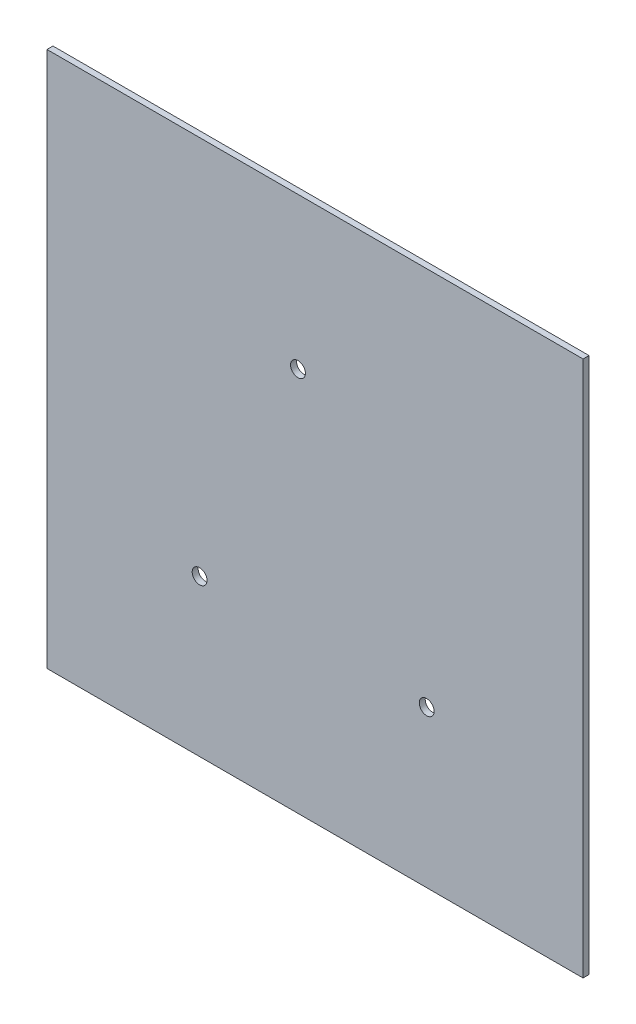
ISO-10303-21;
HEADER;
FILE_DESCRIPTION(('STEP AP214'),'2;1');
FILE_NAME('part.step','',(''),(''),'','','');
FILE_SCHEMA(('AUTOMOTIVE_DESIGN { 1 0 10303 214 1 1 1 1 }'));
ENDSEC;
DATA;
#1=APPLICATION_CONTEXT('core data for automotive mechanical design processes');
#2=APPLICATION_PROTOCOL_DEFINITION('international standard','automotive_design',2000,#1);
#3=PRODUCT_CONTEXT('',#1,'mechanical');
#4=PRODUCT('Part','Part','',(#3));
#5=PRODUCT_RELATED_PRODUCT_CATEGORY('part','',(#4));
#6=PRODUCT_DEFINITION_FORMATION('','',#4);
#7=PRODUCT_DEFINITION_CONTEXT('part definition',#1,'design');
#8=PRODUCT_DEFINITION('design','',#6,#7);
#9=PRODUCT_DEFINITION_SHAPE('','',#8);
#10=(LENGTH_UNIT() NAMED_UNIT(*) SI_UNIT(.MILLI.,.METRE.));
#11=(NAMED_UNIT(*) PLANE_ANGLE_UNIT() SI_UNIT($,.RADIAN.));
#12=(NAMED_UNIT(*) SI_UNIT($,.STERADIAN.) SOLID_ANGLE_UNIT());
#13=UNCERTAINTY_MEASURE_WITH_UNIT(LENGTH_MEASURE(1.E-05),#10,'distance_accuracy_value','');
#14=(GEOMETRIC_REPRESENTATION_CONTEXT(3) GLOBAL_UNCERTAINTY_ASSIGNED_CONTEXT((#13)) GLOBAL_UNIT_ASSIGNED_CONTEXT((#10,
#11,#12)) REPRESENTATION_CONTEXT('',''));
#15=CARTESIAN_POINT('',(0.,0.,0.));
#16=DIRECTION('',(0.,0.,1.));
#17=DIRECTION('',(1.,0.,0.));
#18=AXIS2_PLACEMENT_3D('',#15,#16,#17);
#19=CARTESIAN_POINT('',(0.,0.,2.54));
#20=DIRECTION('',(0.,0.,-1.));
#21=DIRECTION('',(-1.,0.,0.));
#22=AXIS2_PLACEMENT_3D('',#19,#20,#21);
#23=PLANE('',#22);
#24=CARTESIAN_POINT('',(-96.839734868248,-0.0738226508443449,2.54));
#25=DIRECTION('',(0.,0.,1.));
#26=DIRECTION('',(1.,0.,0.));
#27=AXIS2_PLACEMENT_3D('',#24,#25,#26);
#28=CIRCLE('',#27,3.175);
#29=CARTESIAN_POINT('',(-93.664734868248,-0.0738226508443449,2.54));
#30=VERTEX_POINT('',#29);
#31=EDGE_CURVE('E115',#30,#30,#28,.T.);
#32=ORIENTED_EDGE('',*,*,#31,.F.);
#33=EDGE_LOOP('',(#32));
#34=FACE_BOUND('',#33,.T.);
#35=DIRECTION('',(0.,1.,0.));
#36=VECTOR('',#35,1.);
#37=CARTESIAN_POINT('',(66.675,161.925,2.54));
#38=LINE('',#37,#36);
#39=CARTESIAN_POINT('',(66.675,-66.675,2.54));
#40=VERTEX_POINT('',#39);
#41=CARTESIAN_POINT('',(66.675,161.925,2.54));
#42=VERTEX_POINT('',#41);
#43=EDGE_CURVE('E85',#40,#42,#38,.T.);
#44=ORIENTED_EDGE('',*,*,#43,.T.);
#45=DIRECTION('',(-1.,0.,0.));
#46=VECTOR('',#45,1.);
#47=CARTESIAN_POINT('',(66.675,161.925,2.54));
#48=LINE('',#47,#46);
#49=CARTESIAN_POINT('',(-161.925,161.925,2.54));
#50=VERTEX_POINT('',#49);
#51=EDGE_CURVE('E80',#42,#50,#48,.T.);
#52=ORIENTED_EDGE('',*,*,#51,.T.);
#53=DIRECTION('',(0.,-1.,0.));
#54=VECTOR('',#53,1.);
#55=CARTESIAN_POINT('',(-161.925,161.925,2.54));
#56=LINE('',#55,#54);
#57=CARTESIAN_POINT('',(-161.925,-66.675,2.54));
#58=VERTEX_POINT('',#57);
#59=EDGE_CURVE('E83',#50,#58,#56,.T.);
#60=ORIENTED_EDGE('',*,*,#59,.T.);
#61=DIRECTION('',(1.,0.,0.));
#62=VECTOR('',#61,1.);
#63=CARTESIAN_POINT('',(66.675,-66.675,2.54));
#64=LINE('',#63,#62);
#65=EDGE_CURVE('E50',#58,#40,#64,.T.);
#66=ORIENTED_EDGE('',*,*,#65,.T.);
#67=EDGE_LOOP('',(#44,#52,#60,#66));
#68=FACE_BOUND('',#67,.T.);
#69=CARTESIAN_POINT('',(0.,0.,2.54));
#70=DIRECTION('',(0.,0.,1.));
#71=DIRECTION('',(1.,0.,0.));
#72=AXIS2_PLACEMENT_3D('',#69,#70,#71);
#73=CIRCLE('',#72,3.175);
#74=CARTESIAN_POINT('',(3.175,0.,2.54));
#75=VERTEX_POINT('',#74);
#76=EDGE_CURVE('E100',#75,#75,#73,.T.);
#77=ORIENTED_EDGE('',*,*,#76,.F.);
#78=EDGE_LOOP('',(#77));
#79=FACE_BOUND('',#78,.T.);
#80=CARTESIAN_POINT('',(-54.8909989244792,97.3900889286899,2.54));
#81=DIRECTION('',(0.,0.,1.));
#82=DIRECTION('',(1.,0.,0.));
#83=AXIS2_PLACEMENT_3D('',#80,#81,#82);
#84=CIRCLE('',#83,3.175);
#85=CARTESIAN_POINT('',(-51.7159989244792,97.3900889286899,2.54));
#86=VERTEX_POINT('',#85);
#87=EDGE_CURVE('E121',#86,#86,#84,.T.);
#88=ORIENTED_EDGE('',*,*,#87,.F.);
#89=EDGE_LOOP('',(#88));
#90=FACE_BOUND('',#89,.T.);
#91=ADVANCED_FACE('F33',(#34,#68,#79,#90),#23,.F.);
#92=CARTESIAN_POINT('',(0.,0.,0.));
#93=DIRECTION('',(0.,0.,-1.));
#94=DIRECTION('',(-1.,0.,0.));
#95=AXIS2_PLACEMENT_3D('',#92,#93,#94);
#96=PLANE('',#95);
#97=CARTESIAN_POINT('',(-96.839734868248,-0.0738226508443449,0.));
#98=DIRECTION('',(0.,0.,1.));
#99=DIRECTION('',(1.,0.,0.));
#100=AXIS2_PLACEMENT_3D('',#97,#98,#99);
#101=CIRCLE('',#100,3.175);
#102=CARTESIAN_POINT('',(-93.664734868248,-0.0738226508443449,0.));
#103=VERTEX_POINT('',#102);
#104=EDGE_CURVE('E118',#103,#103,#101,.T.);
#105=ORIENTED_EDGE('',*,*,#104,.T.);
#106=EDGE_LOOP('',(#105));
#107=FACE_BOUND('',#106,.T.);
#108=DIRECTION('',(0.,1.,0.));
#109=VECTOR('',#108,1.);
#110=CARTESIAN_POINT('',(66.675,161.925,0.));
#111=LINE('',#110,#109);
#112=CARTESIAN_POINT('',(66.675,-66.675,0.));
#113=VERTEX_POINT('',#112);
#114=CARTESIAN_POINT('',(66.675,161.925,0.));
#115=VERTEX_POINT('',#114);
#116=EDGE_CURVE('E97',#113,#115,#111,.T.);
#117=ORIENTED_EDGE('',*,*,#116,.F.);
#118=DIRECTION('',(1.,0.,0.));
#119=VECTOR('',#118,1.);
#120=CARTESIAN_POINT('',(66.675,-66.675,0.));
#121=LINE('',#120,#119);
#122=CARTESIAN_POINT('',(-161.925,-66.675,0.));
#123=VERTEX_POINT('',#122);
#124=EDGE_CURVE('E73',#123,#113,#121,.T.);
#125=ORIENTED_EDGE('',*,*,#124,.F.);
#126=DIRECTION('',(0.,-1.,0.));
#127=VECTOR('',#126,1.);
#128=CARTESIAN_POINT('',(-161.925,161.925,0.));
#129=LINE('',#128,#127);
#130=CARTESIAN_POINT('',(-161.925,161.925,0.));
#131=VERTEX_POINT('',#130);
#132=EDGE_CURVE('E67',#131,#123,#129,.T.);
#133=ORIENTED_EDGE('',*,*,#132,.F.);
#134=DIRECTION('',(-1.,0.,0.));
#135=VECTOR('',#134,1.);
#136=CARTESIAN_POINT('',(66.675,161.925,0.));
#137=LINE('',#136,#135);
#138=EDGE_CURVE('E89',#115,#131,#137,.T.);
#139=ORIENTED_EDGE('',*,*,#138,.F.);
#140=EDGE_LOOP('',(#117,#125,#133,#139));
#141=FACE_BOUND('',#140,.T.);
#142=CARTESIAN_POINT('',(0.,0.,0.));
#143=DIRECTION('',(0.,0.,1.));
#144=DIRECTION('',(1.,0.,0.));
#145=AXIS2_PLACEMENT_3D('',#142,#143,#144);
#146=CIRCLE('',#145,3.175);
#147=CARTESIAN_POINT('',(3.175,0.,0.));
#148=VERTEX_POINT('',#147);
#149=EDGE_CURVE('E112',#148,#148,#146,.T.);
#150=ORIENTED_EDGE('',*,*,#149,.T.);
#151=EDGE_LOOP('',(#150));
#152=FACE_BOUND('',#151,.T.);
#153=CARTESIAN_POINT('',(-54.8909989244792,97.3900889286899,0.));
#154=DIRECTION('',(0.,0.,1.));
#155=DIRECTION('',(1.,0.,0.));
#156=AXIS2_PLACEMENT_3D('',#153,#154,#155);
#157=CIRCLE('',#156,3.175);
#158=CARTESIAN_POINT('',(-51.7159989244792,97.3900889286899,0.));
#159=VERTEX_POINT('',#158);
#160=EDGE_CURVE('E124',#159,#159,#157,.T.);
#161=ORIENTED_EDGE('',*,*,#160,.T.);
#162=EDGE_LOOP('',(#161));
#163=FACE_BOUND('',#162,.T.);
#164=ADVANCED_FACE('F108',(#107,#141,#152,#163),#96,.T.);
#165=CARTESIAN_POINT('',(66.675,161.925,2.54));
#166=DIRECTION('',(-1.,0.,0.));
#167=DIRECTION('',(0.,-1.,0.));
#168=AXIS2_PLACEMENT_3D('',#165,#166,#167);
#169=PLANE('',#168);
#170=ORIENTED_EDGE('',*,*,#116,.T.);
#171=DIRECTION('',(0.,0.,-1.));
#172=VECTOR('',#171,1.);
#173=CARTESIAN_POINT('',(66.675,161.925,2.54));
#174=LINE('',#173,#172);
#175=EDGE_CURVE('E11',#42,#115,#174,.T.);
#176=ORIENTED_EDGE('',*,*,#175,.F.);
#177=ORIENTED_EDGE('',*,*,#43,.F.);
#178=DIRECTION('',(0.,0.,-1.));
#179=VECTOR('',#178,1.);
#180=CARTESIAN_POINT('',(66.675,-66.675,2.54));
#181=LINE('',#180,#179);
#182=EDGE_CURVE('E93',#40,#113,#181,.T.);
#183=ORIENTED_EDGE('',*,*,#182,.T.);
#184=EDGE_LOOP('',(#170,#176,#177,#183));
#185=FACE_BOUND('',#184,.T.);
#186=ADVANCED_FACE('F35',(#185),#169,.F.);
#187=CARTESIAN_POINT('',(66.675,161.925,2.54));
#188=DIRECTION('',(0.,-1.,0.));
#189=DIRECTION('',(1.,0.,0.));
#190=AXIS2_PLACEMENT_3D('',#187,#188,#189);
#191=PLANE('',#190);
#192=ORIENTED_EDGE('',*,*,#138,.T.);
#193=DIRECTION('',(0.,0.,-1.));
#194=VECTOR('',#193,1.);
#195=CARTESIAN_POINT('',(-161.925,161.925,2.54));
#196=LINE('',#195,#194);
#197=EDGE_CURVE('E42',#50,#131,#196,.T.);
#198=ORIENTED_EDGE('',*,*,#197,.F.);
#199=ORIENTED_EDGE('',*,*,#51,.F.);
#200=ORIENTED_EDGE('',*,*,#175,.T.);
#201=EDGE_LOOP('',(#192,#198,#199,#200));
#202=FACE_BOUND('',#201,.T.);
#203=ADVANCED_FACE('F88',(#202),#191,.F.);
#204=CARTESIAN_POINT('',(-161.925,161.925,2.54));
#205=DIRECTION('',(1.,0.,0.));
#206=DIRECTION('',(0.,1.,0.));
#207=AXIS2_PLACEMENT_3D('',#204,#205,#206);
#208=PLANE('',#207);
#209=ORIENTED_EDGE('',*,*,#132,.T.);
#210=DIRECTION('',(0.,0.,-1.));
#211=VECTOR('',#210,1.);
#212=CARTESIAN_POINT('',(-161.925,-66.675,2.54));
#213=LINE('',#212,#211);
#214=EDGE_CURVE('E90',#58,#123,#213,.T.);
#215=ORIENTED_EDGE('',*,*,#214,.F.);
#216=ORIENTED_EDGE('',*,*,#59,.F.);
#217=ORIENTED_EDGE('',*,*,#197,.T.);
#218=EDGE_LOOP('',(#209,#215,#216,#217));
#219=FACE_BOUND('',#218,.T.);
#220=ADVANCED_FACE('F91',(#219),#208,.F.);
#221=CARTESIAN_POINT('',(66.675,-66.675,2.54));
#222=DIRECTION('',(0.,1.,0.));
#223=DIRECTION('',(-1.,0.,0.));
#224=AXIS2_PLACEMENT_3D('',#221,#222,#223);
#225=PLANE('',#224);
#226=ORIENTED_EDGE('',*,*,#124,.T.);
#227=ORIENTED_EDGE('',*,*,#182,.F.);
#228=ORIENTED_EDGE('',*,*,#65,.F.);
#229=ORIENTED_EDGE('',*,*,#214,.T.);
#230=EDGE_LOOP('',(#226,#227,#228,#229));
#231=FACE_BOUND('',#230,.T.);
#232=ADVANCED_FACE('F105',(#231),#225,.F.);
#233=CARTESIAN_POINT('',(0.,0.,2.54));
#234=DIRECTION('',(0.,0.,-1.));
#235=DIRECTION('',(-1.,0.,0.));
#236=AXIS2_PLACEMENT_3D('',#233,#234,#235);
#237=CYLINDRICAL_SURFACE('',#236,3.175);
#238=ORIENTED_EDGE('',*,*,#76,.T.);
#239=EDGE_LOOP('',(#238));
#240=FACE_BOUND('',#239,.T.);
#241=ORIENTED_EDGE('',*,*,#149,.F.);
#242=EDGE_LOOP('',(#241));
#243=FACE_BOUND('',#242,.T.);
#244=ADVANCED_FACE('F143',(#240,#243),#237,.F.);
#245=CARTESIAN_POINT('',(-96.839734868248,-0.0738226508443449,2.54));
#246=DIRECTION('',(0.,0.,-1.));
#247=DIRECTION('',(-1.,0.,0.));
#248=AXIS2_PLACEMENT_3D('',#245,#246,#247);
#249=CYLINDRICAL_SURFACE('',#248,3.175);
#250=ORIENTED_EDGE('',*,*,#31,.T.);
#251=EDGE_LOOP('',(#250));
#252=FACE_BOUND('',#251,.T.);
#253=ORIENTED_EDGE('',*,*,#104,.F.);
#254=EDGE_LOOP('',(#253));
#255=FACE_BOUND('',#254,.T.);
#256=ADVANCED_FACE('F189',(#252,#255),#249,.F.);
#257=CARTESIAN_POINT('',(-54.8909989244792,97.3900889286899,2.54));
#258=DIRECTION('',(0.,0.,-1.));
#259=DIRECTION('',(-1.,0.,0.));
#260=AXIS2_PLACEMENT_3D('',#257,#258,#259);
#261=CYLINDRICAL_SURFACE('',#260,3.175);
#262=ORIENTED_EDGE('',*,*,#87,.T.);
#263=EDGE_LOOP('',(#262));
#264=FACE_BOUND('',#263,.T.);
#265=ORIENTED_EDGE('',*,*,#160,.F.);
#266=EDGE_LOOP('',(#265));
#267=FACE_BOUND('',#266,.T.);
#268=ADVANCED_FACE('F130',(#264,#267),#261,.F.);
#269=CLOSED_SHELL('',(#91,#164,#186,#203,#220,#232,#244,#256,#268));
#270=MANIFOLD_SOLID_BREP('B2',#269);
#271=ADVANCED_BREP_SHAPE_REPRESENTATION('',(#18,#270),#14);
#272=SHAPE_DEFINITION_REPRESENTATION(#9,#271);
ENDSEC;
END-ISO-10303-21;
